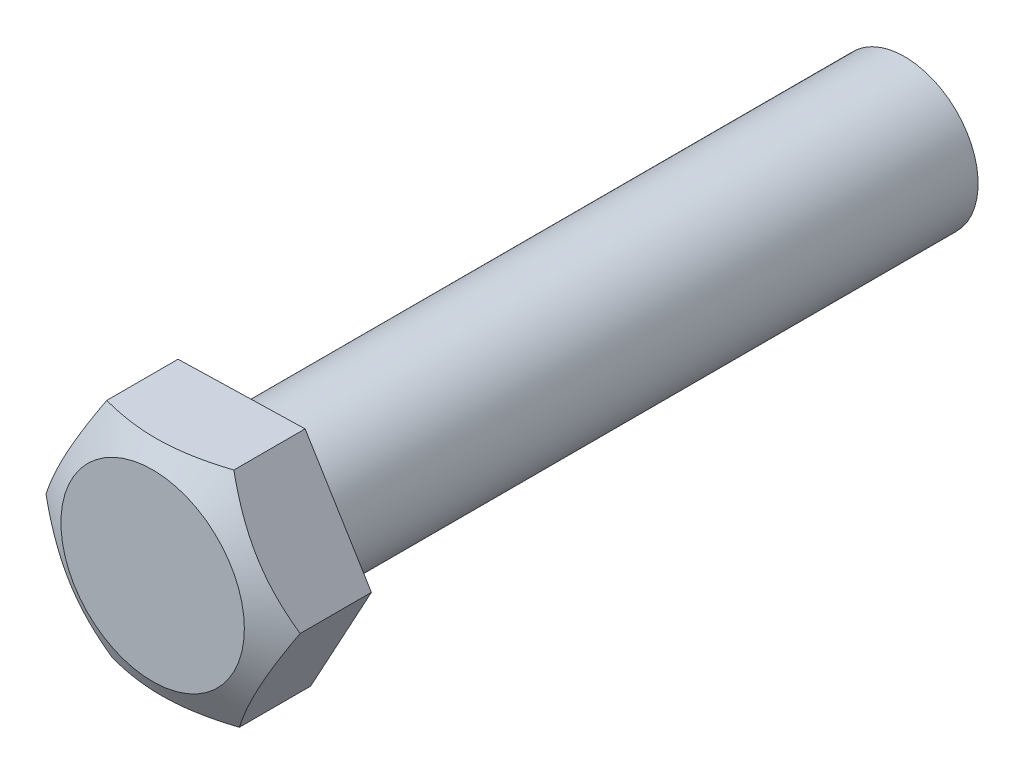
ISO-10303-21;
HEADER;
FILE_DESCRIPTION(('STEP AP214'),'2;1');
FILE_NAME('part.step','',(''),(''),'','','');
FILE_SCHEMA(('AUTOMOTIVE_DESIGN { 1 0 10303 214 1 1 1 1 }'));
ENDSEC;
DATA;
#1=APPLICATION_CONTEXT('core data for automotive mechanical design processes');
#2=APPLICATION_PROTOCOL_DEFINITION('international standard','automotive_design',2000,#1);
#3=PRODUCT_CONTEXT('',#1,'mechanical');
#4=PRODUCT('Part','Part','',(#3));
#5=PRODUCT_RELATED_PRODUCT_CATEGORY('part','',(#4));
#6=PRODUCT_DEFINITION_FORMATION('','',#4);
#7=PRODUCT_DEFINITION_CONTEXT('part definition',#1,'design');
#8=PRODUCT_DEFINITION('design','',#6,#7);
#9=PRODUCT_DEFINITION_SHAPE('','',#8);
#10=(LENGTH_UNIT() NAMED_UNIT(*) SI_UNIT(.MILLI.,.METRE.));
#11=(NAMED_UNIT(*) PLANE_ANGLE_UNIT() SI_UNIT($,.RADIAN.));
#12=(NAMED_UNIT(*) SI_UNIT($,.STERADIAN.) SOLID_ANGLE_UNIT());
#13=UNCERTAINTY_MEASURE_WITH_UNIT(LENGTH_MEASURE(1.E-05),#10,'distance_accuracy_value','');
#14=(GEOMETRIC_REPRESENTATION_CONTEXT(3) GLOBAL_UNCERTAINTY_ASSIGNED_CONTEXT((#13)) GLOBAL_UNIT_ASSIGNED_CONTEXT((#10,
#11,#12)) REPRESENTATION_CONTEXT('',''));
#15=CARTESIAN_POINT('',(0.,0.,0.));
#16=DIRECTION('',(0.,0.,1.));
#17=DIRECTION('',(1.,0.,0.));
#18=AXIS2_PLACEMENT_3D('',#15,#16,#17);
#19=CARTESIAN_POINT('',(17.3150359330285,0.435351166221849,102.5));
#20=DIRECTION('',(-0.853184291000917,-0.521609591159196,0.));
#21=DIRECTION('',(0.521609591159196,-0.853184291000917,0.));
#22=AXIS2_PLACEMENT_3D('',#19,#20,#21);
#23=PLANE('',#22);
#24=CARTESIAN_POINT('',(17.3151582066326,0.43515116622185,99.7168106941296));
#25=CARTESIAN_POINT('',(17.1165824842698,0.759956709995697,99.8267015753732));
#26=CARTESIAN_POINT('',(16.917232209879,1.08602916993449,99.9316058183182));
#27=CARTESIAN_POINT('',(16.5169331062232,1.74078880765869,100.130054912604));
#28=CARTESIAN_POINT('',(16.3159837742192,2.06947680776233,100.223596027869));
#29=CARTESIAN_POINT('',(15.9120981976447,2.73010275317373,100.398061481965));
#30=CARTESIAN_POINT('',(15.7091584187988,3.06204647941113,100.478955969228));
#31=CARTESIAN_POINT('',(15.3018686748109,3.7282405397695,100.626391125923));
#32=CARTESIAN_POINT('',(15.0975187908053,4.06249074117784,100.692932614222));
#33=CARTESIAN_POINT('',(14.6926450598062,4.72473298706844,100.80883153491));
#34=CARTESIAN_POINT('',(14.4921512710168,5.05267586606769,100.858572572056));
#35=CARTESIAN_POINT('',(14.0902449917149,5.71006432242831,100.94197729784));
#36=CARTESIAN_POINT('',(13.8888324835943,6.03950992859065,100.975640677019));
#37=CARTESIAN_POINT('',(13.4856691221248,6.69895456408607,101.026040105919));
#38=CARTESIAN_POINT('',(13.2839189575518,7.02895246680498,101.042796270541));
#39=CARTESIAN_POINT('',(12.8802323933276,7.68925289249076,101.059020916761));
#40=CARTESIAN_POINT('',(12.6782959996238,8.0195554057298,101.058489932531));
#41=CARTESIAN_POINT('',(12.3007772995254,8.63705368402493,101.041347807051));
#42=CARTESIAN_POINT('',(12.1251680897067,8.92429345436618,101.026827592722));
#43=CARTESIAN_POINT('',(11.7743536121434,9.49811227669188,100.984987315502));
#44=CARTESIAN_POINT('',(11.5991483738516,9.78469128050085,100.957666347242));
#45=CARTESIAN_POINT('',(11.249237004764,10.3570329099649,100.890700919685));
#46=CARTESIAN_POINT('',(11.0745314068966,10.6427946639218,100.851046282278));
#47=CARTESIAN_POINT('',(10.7259392629905,11.2129784684146,100.760109247187));
#48=CARTESIAN_POINT('',(10.5520527734532,11.4974004265323,100.708826059025));
#49=CARTESIAN_POINT('',(10.0242106843328,12.3607790648848,100.53623729958));
#50=CARTESIAN_POINT('',(9.6717836267386,12.9372355456692,100.397722851818));
#51=CARTESIAN_POINT('',(8.97218461959457,14.0815528531188,100.083351742079));
#52=CARTESIAN_POINT('',(8.62500371288104,14.6494283308015,99.9075689109206));
#53=CARTESIAN_POINT('',(8.28037052339485,15.213136568554,99.7168106941296));
#54=B_SPLINE_CURVE_WITH_KNOTS('',3,(#24,#25,#26,#27,#28,#29,#30,#31,#32,#33,#34,#35,#36,#37,#38,
#39,#40,#41,#42,#43,#44,#45,#46,#47,#48,#49,#50,#51,#52,#53),.UNSPECIFIED.,.F.,.F.,(4,2,2,2,2,2,
2,2,2,2,2,2,2,2,4),(0.,1.18875423395915,2.3778982658904,3.56980814311689,4.76165000141671,
5.92407438679102,7.08652114536433,8.24758327795976,9.40860953381671,10.4193085296126,
11.4300790206272,12.4416858525291,13.4533614714401,15.5212018248961,17.5849833185538),.UNSPECIFIED.);
#55=CARTESIAN_POINT('',(17.3150359330285,0.43535116622185,99.7168783648703));
#56=VERTEX_POINT('',#55);
#57=CARTESIAN_POINT('',(8.28049279699896,15.212936568554,99.7168783648703));
#58=VERTEX_POINT('',#57);
#59=EDGE_CURVE('E95',#56,#58,#54,.T.);
#60=ORIENTED_EDGE('',*,*,#59,.F.);
#61=DIRECTION('',(0.,0.,-1.));
#62=VECTOR('',#61,1.);
#63=CARTESIAN_POINT('',(17.3150359330285,0.435351166221849,102.5));
#64=LINE('',#63,#62);
#65=CARTESIAN_POINT('',(17.3150359330285,0.435351166221849,90.));
#66=VERTEX_POINT('',#65);
#67=EDGE_CURVE('E64',#56,#66,#64,.T.);
#68=ORIENTED_EDGE('',*,*,#67,.T.);
#69=DIRECTION('',(-0.521609591159196,0.853184291000917,0.));
#70=VECTOR('',#69,1.);
#71=CARTESIAN_POINT('',(17.3150359330285,0.435351166221849,90.));
#72=LINE('',#71,#70);
#73=CARTESIAN_POINT('',(8.28049279699896,15.212936568554,90.));
#74=VERTEX_POINT('',#73);
#75=EDGE_CURVE('E105',#66,#74,#72,.T.);
#76=ORIENTED_EDGE('',*,*,#75,.T.);
#77=DIRECTION('',(0.,0.,-1.));
#78=VECTOR('',#77,1.);
#79=CARTESIAN_POINT('',(8.28049279699896,15.212936568554,102.5));
#80=LINE('',#79,#78);
#81=EDGE_CURVE('E103',#58,#74,#80,.T.);
#82=ORIENTED_EDGE('',*,*,#81,.F.);
#83=EDGE_LOOP('',(#60,#68,#76,#82));
#84=FACE_BOUND('',#83,.T.);
#85=ADVANCED_FACE('F40',(#84),#23,.F.);
#86=CARTESIAN_POINT('',(8.28049279699896,15.212936568554,102.5));
#87=DIRECTION('',(0.02513501130102,-0.999684065696207,0.));
#88=DIRECTION('',(0.999684065696207,0.02513501130102,0.));
#89=AXIS2_PLACEMENT_3D('',#86,#87,#88);
#90=PLANE('',#89);
#91=CARTESIAN_POINT('',(8.28069279699896,15.212941597145,99.7168206110968));
#92=CARTESIAN_POINT('',(7.90011537285567,15.2033727561631,99.8267110821961));
#93=CARTESIAN_POINT('',(7.51805349243785,15.1937665915642,99.9316149048082));
#94=CARTESIAN_POINT('',(6.7508660480607,15.1744772323095,100.13006314023));
#95=CARTESIAN_POINT('',(6.36573952058568,15.1647940134281,100.22360381696));
#96=CARTESIAN_POINT('',(5.5916784935187,15.1453318319943,100.398068375075));
#97=CARTESIAN_POINT('',(5.20273722045012,15.1355526991368,100.478962405175));
#98=CARTESIAN_POINT('',(4.42215201300655,15.1159264805306,100.626396637637));
#99=CARTESIAN_POINT('',(4.03050823413113,15.1060793986916,100.692937658866));
#100=CARTESIAN_POINT('',(3.25455338832283,15.0865696010588,100.808835660384));
#101=CARTESIAN_POINT('',(2.87029992842644,15.0769083336761,100.858576244015));
#102=CARTESIAN_POINT('',(2.10003230071689,15.057541529511,100.941980066949));
#103=CARTESIAN_POINT('',(1.71401809915714,15.0478359918802,100.975642996787));
#104=CARTESIAN_POINT('',(0.941341260339787,15.028408613029,101.026041542926));
#105=CARTESIAN_POINT('',(0.554679943112687,15.0186868049982,101.042797273947));
#106=CARTESIAN_POINT('',(-0.218999598433115,14.9992342152377,101.05902107921));
#107=CARTESIAN_POINT('',(-0.606017811353921,14.9895034337946,101.058489687637));
#108=CARTESIAN_POINT('',(-1.32954345522838,14.9713118612174,101.041346887667));
#109=CARTESIAN_POINT('',(-1.66610245184731,14.9628497735701,101.0268264883));
#110=CARTESIAN_POINT('',(-2.33844627785228,14.9459450631274,100.984986041552));
#111=CARTESIAN_POINT('',(-2.67423105079217,14.9375024417511,100.957665088839));
#112=CARTESIAN_POINT('',(-3.34484404423146,14.9206412495534,100.890699885318));
#113=CARTESIAN_POINT('',(-3.67967124338969,14.9122227044115,100.851045456798));
#114=CARTESIAN_POINT('',(-4.34775592099624,14.8954250815445,100.760109018103));
#115=CARTESIAN_POINT('',(-4.68101329116073,14.8870460065421,100.708826217473));
#116=CARTESIAN_POINT('',(-5.6926344037747,14.8616108626097,100.536238907584));
#117=CARTESIAN_POINT('',(-6.36806868669335,14.8446284489484,100.397725786675));
#118=CARTESIAN_POINT('',(-7.70886582016779,14.8109168471947,100.083357834852));
#119=CARTESIAN_POINT('',(-8.37424583683692,14.7941872274955,99.9075768322541));
#120=CARTESIAN_POINT('',(-9.03474313602957,14.7775803737412,99.7168206110968));
#121=B_SPLINE_CURVE_WITH_KNOTS('',3,(#91,#92,#93,#94,#95,#96,#97,#98,#99,#100,#101,#102,#103,
#104,#105,#106,#107,#108,#109,#110,#111,#112,#113,#114,#115,#116,#117,#118,#119,#120),
.UNSPECIFIED.,.F.,.F.,(4,2,2,2,2,2,2,2,2,2,2,2,2,2,4),(0.,1.18875305866262,2.37789591475583,
3.56980458401566,4.76164523455343,5.9240685561093,7.08651425121304,8.24757533279197,
9.4086005367311,10.4192919280838,11.4300548125104,12.4416540118535,13.453321996548,
15.5211462829323,17.584911823434),.UNSPECIFIED.);
#122=CARTESIAN_POINT('',(-9.03454313602957,14.7775854023322,99.7168783648703));
#123=VERTEX_POINT('',#122);
#124=EDGE_CURVE('E106',#58,#123,#121,.T.);
#125=ORIENTED_EDGE('',*,*,#124,.F.);
#126=ORIENTED_EDGE('',*,*,#81,.T.);
#127=DIRECTION('',(-0.999684065696207,-0.02513501130102,0.));
#128=VECTOR('',#127,1.);
#129=CARTESIAN_POINT('',(8.28049279699896,15.212936568554,90.));
#130=LINE('',#129,#128);
#131=CARTESIAN_POINT('',(-9.03454313602957,14.7775854023322,90.));
#132=VERTEX_POINT('',#131);
#133=EDGE_CURVE('E294',#74,#132,#130,.T.);
#134=ORIENTED_EDGE('',*,*,#133,.T.);
#135=DIRECTION('',(0.,0.,-1.));
#136=VECTOR('',#135,1.);
#137=CARTESIAN_POINT('',(-9.03454313602957,14.7775854023322,102.5));
#138=LINE('',#137,#136);
#139=EDGE_CURVE('E128',#123,#132,#138,.T.);
#140=ORIENTED_EDGE('',*,*,#139,.F.);
#141=EDGE_LOOP('',(#125,#126,#134,#140));
#142=FACE_BOUND('',#141,.T.);
#143=ADVANCED_FACE('F152',(#142),#90,.F.);
#144=CARTESIAN_POINT('',(-9.03454313602957,14.7775854023322,102.5));
#145=DIRECTION('',(0.878319302301937,-0.478074474537011,0.));
#146=DIRECTION('',(0.478074474537011,0.878319302301937,0.));
#147=AXIS2_PLACEMENT_3D('',#144,#145,#146);
#148=PLANE('',#147);
#149=CARTESIAN_POINT('',(-9.03443427482766,14.7777854023322,99.7168126306936));
#150=CARTESIAN_POINT('',(-9.21643623883354,14.4434110599286,99.8267034318453));
#151=CARTESIAN_POINT('',(-9.39914810828523,14.1077324779368,99.9316075927087));
#152=CARTESIAN_POINT('',(-9.76603698127246,13.4336835669244,100.130056519278));
#153=CARTESIAN_POINT('',(-9.95021444558672,13.0953123913604,100.223597548907));
#154=CARTESIAN_POINT('',(-10.3203904512398,12.4152243541795,100.398062828037));
#155=CARTESIAN_POINT('',(-10.5063922318642,12.0735015413414,100.478957226027));
#156=CARTESIAN_POINT('',(-10.8796882797871,11.3876813567744,100.62639220224));
#157=CARTESIAN_POINT('',(-11.0669824727214,11.0435841216677,100.692933599331));
#158=CARTESIAN_POINT('',(-11.4380641569669,10.3618321701142,100.808832340525));
#159=CARTESIAN_POINT('',(-11.621824098881,10.0242280674703,100.85857328911));
#160=CARTESIAN_POINT('',(-11.9901860051316,9.3474728970421,100.941977838588));
#161=CARTESIAN_POINT('',(-12.1747879856066,9.00832179960821,100.97564113002));
#162=CARTESIAN_POINT('',(-12.5443020510253,8.32944988024123,101.026040386537));
#163=CARTESIAN_POINT('',(-12.7292135046836,7.98973021810682,101.042796466486));
#164=CARTESIAN_POINT('',(-13.0992071015302,7.30997730272025,101.059020948486));
#165=CARTESIAN_POINT('',(-13.2842892392675,6.96994405948244,101.058489884711));
#166=CARTESIAN_POINT('',(-13.6302988140094,6.33425463353808,101.041347627517));
#167=CARTESIAN_POINT('',(-13.7912509093944,6.03855314840964,101.026827377055));
#168=CARTESIAN_POINT('',(-14.1127848725705,5.44783036096806,100.984987066729));
#169=CARTESIAN_POINT('',(-14.2733667133669,5.15280910824941,100.957666101505));
#170=CARTESIAN_POINT('',(-14.5940729450037,4.56360703071138,100.890700717696));
#171=CARTESIAN_POINT('',(-14.7541968473988,4.26942710326446,100.85104612108));
#172=CARTESIAN_POINT('',(-15.0736939629991,3.68244641592848,100.760109202452));
#173=CARTESIAN_POINT('',(-15.2330671244189,3.38964575117964,100.708826089966));
#174=CARTESIAN_POINT('',(-15.7168531885299,2.5008331060267,100.536237613587));
#175=CARTESIAN_POINT('',(-16.0398651304317,1.90739497335669,100.39772342493));
#176=CARTESIAN_POINT('',(-16.6810725299099,0.729367561861971,100.083352931862));
#177=CARTESIAN_POINT('',(-16.9992761969998,0.144763200503869,99.9075704577816));
#178=CARTESIAN_POINT('',(-17.3151447942304,-0.435551166221849,99.7168126306936));
#179=B_SPLINE_CURVE_WITH_KNOTS('',3,(#149,#150,#151,#152,#153,#154,#155,#156,#157,#158,#159,
#160,#161,#162,#163,#164,#165,#166,#167,#168,#169,#170,#171,#172,#173,#174,#175,#176,#177,#178),
.UNSPECIFIED.,.F.,.F.,(4,2,2,2,2,2,2,2,2,2,2,2,2,2,4),(0.,1.18875400444979,2.37789780676592,
3.56980744810329,4.76164907055395,5.92407324818807,7.08651979908933,8.24758172644452,
9.40860777688521,10.4193052877038,11.4300742933223,12.4416796347565,13.4533537628761,
15.5211909787924,17.5849693571557),.UNSPECIFIED.);
#180=CARTESIAN_POINT('',(-17.3150359330285,-0.43535116622185,99.7168783648703));
#181=VERTEX_POINT('',#180);
#182=EDGE_CURVE('E203',#123,#181,#179,.T.);
#183=ORIENTED_EDGE('',*,*,#182,.F.);
#184=ORIENTED_EDGE('',*,*,#139,.T.);
#185=DIRECTION('',(-0.478074474537011,-0.878319302301937,0.));
#186=VECTOR('',#185,1.);
#187=CARTESIAN_POINT('',(-9.03454313602957,14.7775854023322,90.));
#188=LINE('',#187,#186);
#189=CARTESIAN_POINT('',(-17.3150359330285,-0.43535116622185,90.));
#190=VERTEX_POINT('',#189);
#191=EDGE_CURVE('E296',#132,#190,#188,.T.);
#192=ORIENTED_EDGE('',*,*,#191,.T.);
#193=DIRECTION('',(0.,0.,-1.));
#194=VECTOR('',#193,1.);
#195=CARTESIAN_POINT('',(-17.3150359330285,-0.43535116622185,102.5));
#196=LINE('',#195,#194);
#197=EDGE_CURVE('E125',#181,#190,#196,.T.);
#198=ORIENTED_EDGE('',*,*,#197,.F.);
#199=EDGE_LOOP('',(#183,#184,#192,#198));
#200=FACE_BOUND('',#199,.T.);
#201=ADVANCED_FACE('F156',(#200),#148,.F.);
#202=CARTESIAN_POINT('',(-17.3150359330285,-0.43535116622185,102.5));
#203=DIRECTION('',(0.853184291000916,0.521609591159196,0.));
#204=DIRECTION('',(-0.521609591159196,0.853184291000916,0.));
#205=AXIS2_PLACEMENT_3D('',#202,#203,#204);
#206=PLANE('',#205);
#207=CARTESIAN_POINT('',(-17.3151582066326,-0.435151166221852,99.7168106941296));
#208=CARTESIAN_POINT('',(-17.1165824842698,-0.759956709995697,99.8267015753732));
#209=CARTESIAN_POINT('',(-16.917232209879,-1.08602916993449,99.9316058183182));
#210=CARTESIAN_POINT('',(-16.5169331062232,-1.74078880765869,100.130054912604));
#211=CARTESIAN_POINT('',(-16.3159837742192,-2.06947680776233,100.223596027869));
#212=CARTESIAN_POINT('',(-15.9120981976447,-2.73010275317373,100.398061481965));
#213=CARTESIAN_POINT('',(-15.7091584187988,-3.06204647941113,100.478955969228));
#214=CARTESIAN_POINT('',(-15.3018686748109,-3.7282405397695,100.626391125923));
#215=CARTESIAN_POINT('',(-15.0975187908053,-4.06249074117784,100.692932614222));
#216=CARTESIAN_POINT('',(-14.6926450598062,-4.72473298706843,100.80883153491));
#217=CARTESIAN_POINT('',(-14.4921512710168,-5.05267586606769,100.858572572056));
#218=CARTESIAN_POINT('',(-14.0902449917149,-5.71006432242831,100.94197729784));
#219=CARTESIAN_POINT('',(-13.8888324835943,-6.03950992859064,100.975640677019));
#220=CARTESIAN_POINT('',(-13.4856691221248,-6.69895456408607,101.026040105919));
#221=CARTESIAN_POINT('',(-13.2839189575518,-7.02895246680498,101.042796270541));
#222=CARTESIAN_POINT('',(-12.8802323933276,-7.68925289249076,101.059020916761));
#223=CARTESIAN_POINT('',(-12.6782959996238,-8.0195554057298,101.058489932531));
#224=CARTESIAN_POINT('',(-12.3007772995254,-8.63705368402493,101.041347807051));
#225=CARTESIAN_POINT('',(-12.1251680897067,-8.92429345436618,101.026827592722));
#226=CARTESIAN_POINT('',(-11.7743536121434,-9.49811227669188,100.984987315502));
#227=CARTESIAN_POINT('',(-11.5991483738516,-9.78469128050085,100.957666347242));
#228=CARTESIAN_POINT('',(-11.249237004764,-10.3570329099649,100.890700919685));
#229=CARTESIAN_POINT('',(-11.0745314068966,-10.6427946639218,100.851046282278));
#230=CARTESIAN_POINT('',(-10.7259392629905,-11.2129784684146,100.760109247187));
#231=CARTESIAN_POINT('',(-10.5520527734532,-11.4974004265323,100.708826059025));
#232=CARTESIAN_POINT('',(-10.0242106843328,-12.3607790648848,100.53623729958));
#233=CARTESIAN_POINT('',(-9.6717836267386,-12.9372355456692,100.397722851818));
#234=CARTESIAN_POINT('',(-8.97218461959456,-14.0815528531188,100.083351742079));
#235=CARTESIAN_POINT('',(-8.62500371288103,-14.6494283308015,99.9075689109206));
#236=CARTESIAN_POINT('',(-8.28037052339485,-15.213136568554,99.7168106941296));
#237=B_SPLINE_CURVE_WITH_KNOTS('',3,(#207,#208,#209,#210,#211,#212,#213,#214,#215,#216,#217,
#218,#219,#220,#221,#222,#223,#224,#225,#226,#227,#228,#229,#230,#231,#232,#233,#234,#235,#236),
.UNSPECIFIED.,.F.,.F.,(4,2,2,2,2,2,2,2,2,2,2,2,2,2,4),(0.,1.18875423395915,2.3778982658904,
3.56980814311688,4.7616500014167,5.92407438679101,7.08652114536432,8.24758327795976,
9.4086095338167,10.4193085296126,11.4300790206272,12.4416858525291,13.4533614714401,
15.5212018248961,17.5849833185538),.UNSPECIFIED.);
#238=CARTESIAN_POINT('',(-8.28049279699896,-15.212936568554,99.7168783648703));
#239=VERTEX_POINT('',#238);
#240=EDGE_CURVE('E197',#181,#239,#237,.T.);
#241=ORIENTED_EDGE('',*,*,#240,.F.);
#242=ORIENTED_EDGE('',*,*,#197,.T.);
#243=DIRECTION('',(0.521609591159196,-0.853184291000916,0.));
#244=VECTOR('',#243,1.);
#245=CARTESIAN_POINT('',(-17.3150359330285,-0.43535116622185,90.));
#246=LINE('',#245,#244);
#247=CARTESIAN_POINT('',(-8.28049279699896,-15.212936568554,90.));
#248=VERTEX_POINT('',#247);
#249=EDGE_CURVE('E299',#190,#248,#246,.T.);
#250=ORIENTED_EDGE('',*,*,#249,.T.);
#251=DIRECTION('',(0.,0.,-1.));
#252=VECTOR('',#251,1.);
#253=CARTESIAN_POINT('',(-8.28049279699896,-15.212936568554,102.5));
#254=LINE('',#253,#252);
#255=EDGE_CURVE('E117',#239,#248,#254,.T.);
#256=ORIENTED_EDGE('',*,*,#255,.F.);
#257=EDGE_LOOP('',(#241,#242,#250,#256));
#258=FACE_BOUND('',#257,.T.);
#259=ADVANCED_FACE('F211',(#258),#206,.F.);
#260=CARTESIAN_POINT('',(-8.28049279699896,-15.212936568554,102.5));
#261=DIRECTION('',(-0.0251350113010201,0.999684065696207,0.));
#262=DIRECTION('',(-0.999684065696207,-0.0251350113010201,0.));
#263=AXIS2_PLACEMENT_3D('',#260,#261,#262);
#264=PLANE('',#263);
#265=CARTESIAN_POINT('',(-8.28069279699896,-15.212941597145,99.7168206110968));
#266=CARTESIAN_POINT('',(-7.90011537285567,-15.2033727561631,99.8267110821961));
#267=CARTESIAN_POINT('',(-7.51805349243784,-15.1937665915642,99.9316149048082));
#268=CARTESIAN_POINT('',(-6.75086604806069,-15.1744772323095,100.13006314023));
#269=CARTESIAN_POINT('',(-6.36573952058568,-15.1647940134281,100.22360381696));
#270=CARTESIAN_POINT('',(-5.5916784935187,-15.1453318319943,100.398068375075));
#271=CARTESIAN_POINT('',(-5.20273722045012,-15.1355526991368,100.478962405175));
#272=CARTESIAN_POINT('',(-4.42215201300654,-15.1159264805306,100.626396637637));
#273=CARTESIAN_POINT('',(-4.03050823413113,-15.1060793986916,100.692937658866));
#274=CARTESIAN_POINT('',(-3.25455338832283,-15.0865696010588,100.808835660384));
#275=CARTESIAN_POINT('',(-2.87029992842644,-15.0769083336761,100.858576244015));
#276=CARTESIAN_POINT('',(-2.10003230071688,-15.057541529511,100.941980066949));
#277=CARTESIAN_POINT('',(-1.71401809915714,-15.0478359918802,100.975642996787));
#278=CARTESIAN_POINT('',(-0.941341260339784,-15.028408613029,101.026041542926));
#279=CARTESIAN_POINT('',(-0.554679943112684,-15.0186868049982,101.042797273947));
#280=CARTESIAN_POINT('',(0.218999598433119,-14.9992342152377,101.05902107921));
#281=CARTESIAN_POINT('',(0.606017811353924,-14.9895034337946,101.058489687637));
#282=CARTESIAN_POINT('',(1.32954345522839,-14.9713118612174,101.041346887667));
#283=CARTESIAN_POINT('',(1.66610245184731,-14.9628497735701,101.0268264883));
#284=CARTESIAN_POINT('',(2.33844627785228,-14.9459450631274,100.984986041552));
#285=CARTESIAN_POINT('',(2.67423105079217,-14.9375024417511,100.957665088839));
#286=CARTESIAN_POINT('',(3.34484404423146,-14.9206412495534,100.890699885318));
#287=CARTESIAN_POINT('',(3.67967124338969,-14.9122227044115,100.851045456798));
#288=CARTESIAN_POINT('',(4.34775592099624,-14.8954250815445,100.760109018103));
#289=CARTESIAN_POINT('',(4.68101329116073,-14.8870460065421,100.708826217473));
#290=CARTESIAN_POINT('',(5.6926344037747,-14.8616108626097,100.536238907584));
#291=CARTESIAN_POINT('',(6.36806868669335,-14.8446284489484,100.397725786675));
#292=CARTESIAN_POINT('',(7.70886582016779,-14.8109168471947,100.083357834852));
#293=CARTESIAN_POINT('',(8.37424583683692,-14.7941872274955,99.9075768322541));
#294=CARTESIAN_POINT('',(9.03474313602957,-14.7775803737412,99.7168206110968));
#295=B_SPLINE_CURVE_WITH_KNOTS('',3,(#265,#266,#267,#268,#269,#270,#271,#272,#273,#274,#275,
#276,#277,#278,#279,#280,#281,#282,#283,#284,#285,#286,#287,#288,#289,#290,#291,#292,#293,#294),
.UNSPECIFIED.,.F.,.F.,(4,2,2,2,2,2,2,2,2,2,2,2,2,2,4),(0.,1.18875305866262,2.37789591475583,
3.56980458401566,4.76164523455343,5.9240685561093,7.08651425121304,8.24757533279197,
9.4086005367311,10.4192919280838,11.4300548125104,12.4416540118535,13.453321996548,
15.5211462829323,17.584911823434),.UNSPECIFIED.);
#296=CARTESIAN_POINT('',(9.03454313602957,-14.7775854023322,99.7168783648703));
#297=VERTEX_POINT('',#296);
#298=EDGE_CURVE('E56',#239,#297,#295,.T.);
#299=ORIENTED_EDGE('',*,*,#298,.F.);
#300=ORIENTED_EDGE('',*,*,#255,.T.);
#301=DIRECTION('',(0.999684065696207,0.0251350113010201,0.));
#302=VECTOR('',#301,1.);
#303=CARTESIAN_POINT('',(-8.28049279699896,-15.212936568554,90.));
#304=LINE('',#303,#302);
#305=CARTESIAN_POINT('',(9.03454313602957,-14.7775854023322,90.));
#306=VERTEX_POINT('',#305);
#307=EDGE_CURVE('E119',#248,#306,#304,.T.);
#308=ORIENTED_EDGE('',*,*,#307,.T.);
#309=DIRECTION('',(0.,0.,-1.));
#310=VECTOR('',#309,1.);
#311=CARTESIAN_POINT('',(9.03454313602957,-14.7775854023322,102.5));
#312=LINE('',#311,#310);
#313=EDGE_CURVE('E113',#297,#306,#312,.T.);
#314=ORIENTED_EDGE('',*,*,#313,.F.);
#315=EDGE_LOOP('',(#299,#300,#308,#314));
#316=FACE_BOUND('',#315,.T.);
#317=ADVANCED_FACE('F215',(#316),#264,.F.);
#318=CARTESIAN_POINT('',(9.03454313602957,-14.7775854023322,102.5));
#319=DIRECTION('',(-0.878319302301937,0.478074474537011,0.));
#320=DIRECTION('',(-0.478074474537011,-0.878319302301937,0.));
#321=AXIS2_PLACEMENT_3D('',#318,#319,#320);
#322=PLANE('',#321);
#323=CARTESIAN_POINT('',(9.03443427482766,-14.7777854023322,99.7168126306936));
#324=CARTESIAN_POINT('',(9.21643623883355,-14.4434110599286,99.8267034318453));
#325=CARTESIAN_POINT('',(9.39914810828523,-14.1077324779368,99.9316075927087));
#326=CARTESIAN_POINT('',(9.76603698127246,-13.4336835669244,100.130056519278));
#327=CARTESIAN_POINT('',(9.95021444558673,-13.0953123913604,100.223597548907));
#328=CARTESIAN_POINT('',(10.3203904512398,-12.4152243541795,100.398062828037));
#329=CARTESIAN_POINT('',(10.5063922318642,-12.0735015413414,100.478957226027));
#330=CARTESIAN_POINT('',(10.8796882797871,-11.3876813567744,100.62639220224));
#331=CARTESIAN_POINT('',(11.0669824727214,-11.0435841216676,100.692933599331));
#332=CARTESIAN_POINT('',(11.4380641569669,-10.3618321701142,100.808832340525));
#333=CARTESIAN_POINT('',(11.621824098881,-10.0242280674703,100.85857328911));
#334=CARTESIAN_POINT('',(11.9901860051316,-9.3474728970421,100.941977838588));
#335=CARTESIAN_POINT('',(12.1747879856066,-9.00832179960821,100.97564113002));
#336=CARTESIAN_POINT('',(12.5443020510253,-8.32944988024122,101.026040386537));
#337=CARTESIAN_POINT('',(12.7292135046836,-7.98973021810682,101.042796466486));
#338=CARTESIAN_POINT('',(13.0992071015302,-7.30997730272024,101.059020948486));
#339=CARTESIAN_POINT('',(13.2842892392675,-6.96994405948243,101.058489884711));
#340=CARTESIAN_POINT('',(13.6302988140094,-6.33425463353807,101.041347627517));
#341=CARTESIAN_POINT('',(13.7912509093944,-6.03855314840964,101.026827377055));
#342=CARTESIAN_POINT('',(14.1127848725705,-5.44783036096806,100.984987066729));
#343=CARTESIAN_POINT('',(14.2733667133669,-5.1528091082494,100.957666101505));
#344=CARTESIAN_POINT('',(14.5940729450037,-4.56360703071138,100.890700717696));
#345=CARTESIAN_POINT('',(14.7541968473988,-4.26942710326445,100.85104612108));
#346=CARTESIAN_POINT('',(15.0736939629991,-3.68244641592848,100.760109202452));
#347=CARTESIAN_POINT('',(15.2330671244189,-3.38964575117963,100.708826089966));
#348=CARTESIAN_POINT('',(15.7168531885299,-2.50083310602669,100.536237613587));
#349=CARTESIAN_POINT('',(16.0398651304317,-1.90739497335669,100.39772342493));
#350=CARTESIAN_POINT('',(16.6810725299099,-0.729367561861972,100.083352931862));
#351=CARTESIAN_POINT('',(16.9992761969998,-0.14476320050387,99.9075704577816));
#352=CARTESIAN_POINT('',(17.3151447942304,0.43555116622185,99.7168126306936));
#353=B_SPLINE_CURVE_WITH_KNOTS('',3,(#323,#324,#325,#326,#327,#328,#329,#330,#331,#332,#333,
#334,#335,#336,#337,#338,#339,#340,#341,#342,#343,#344,#345,#346,#347,#348,#349,#350,#351,#352),
.UNSPECIFIED.,.F.,.F.,(4,2,2,2,2,2,2,2,2,2,2,2,2,2,4),(0.,1.18875400444978,2.37789780676592,
3.56980744810329,4.76164907055395,5.92407324818808,7.08651979908933,8.24758172644452,
9.40860777688521,10.4193052877038,11.4300742933223,12.4416796347565,13.4533537628761,
15.5211909787924,17.5849693571557),.UNSPECIFIED.);
#354=EDGE_CURVE('E93',#297,#56,#353,.T.);
#355=ORIENTED_EDGE('',*,*,#354,.F.);
#356=ORIENTED_EDGE('',*,*,#313,.T.);
#357=DIRECTION('',(0.478074474537011,0.878319302301937,0.));
#358=VECTOR('',#357,1.);
#359=CARTESIAN_POINT('',(9.03454313602957,-14.7775854023322,90.));
#360=LINE('',#359,#358);
#361=EDGE_CURVE('E110',#306,#66,#360,.T.);
#362=ORIENTED_EDGE('',*,*,#361,.T.);
#363=ORIENTED_EDGE('',*,*,#67,.F.);
#364=EDGE_LOOP('',(#355,#356,#362,#363));
#365=FACE_BOUND('',#364,.T.);
#366=ADVANCED_FACE('F108',(#365),#322,.F.);
#367=CARTESIAN_POINT('',(0.,0.,90.));
#368=DIRECTION('',(0.,0.,-1.));
#369=DIRECTION('',(-1.,0.,0.));
#370=AXIS2_PLACEMENT_3D('',#367,#368,#369);
#371=CYLINDRICAL_SURFACE('',#370,10.);
#372=CARTESIAN_POINT('',(0.,0.,90.));
#373=DIRECTION('',(0.,0.,1.));
#374=DIRECTION('',(1.,0.,0.));
#375=AXIS2_PLACEMENT_3D('',#372,#373,#374);
#376=CIRCLE('',#375,10.);
#377=CARTESIAN_POINT('',(-10.,0.,90.));
#378=VERTEX_POINT('',#377);
#379=EDGE_CURVE('E12',#378,#378,#376,.T.);
#380=CARTESIAN_POINT('',(0.,0.,0.));
#381=DIRECTION('',(0.,0.,1.));
#382=DIRECTION('',(1.,0.,0.));
#383=AXIS2_PLACEMENT_3D('',#380,#381,#382);
#384=CIRCLE('',#383,10.);
#385=CARTESIAN_POINT('',(-10.,0.,0.));
#386=VERTEX_POINT('',#385);
#387=EDGE_CURVE('E44',#386,#386,#384,.T.);
#388=CARTESIAN_POINT('',(-10.,0.,90.));
#389=CARTESIAN_POINT('',(-10.,0.,89.0625));
#390=CARTESIAN_POINT('',(-10.,0.,88.125));
#391=CARTESIAN_POINT('',(-10.,0.,86.25));
#392=CARTESIAN_POINT('',(-10.,0.,85.3125));
#393=CARTESIAN_POINT('',(-10.,0.,83.4375));
#394=CARTESIAN_POINT('',(-10.,0.,82.5));
#395=CARTESIAN_POINT('',(-10.,0.,80.625));
#396=CARTESIAN_POINT('',(-10.,0.,79.6875));
#397=CARTESIAN_POINT('',(-10.,0.,77.8125));
#398=CARTESIAN_POINT('',(-10.,0.,76.875));
#399=CARTESIAN_POINT('',(-10.,0.,75.));
#400=CARTESIAN_POINT('',(-10.,0.,74.0625));
#401=CARTESIAN_POINT('',(-10.,0.,72.1875));
#402=CARTESIAN_POINT('',(-10.,0.,71.25));
#403=CARTESIAN_POINT('',(-10.,0.,69.375));
#404=CARTESIAN_POINT('',(-10.,0.,68.4375));
#405=CARTESIAN_POINT('',(-10.,0.,66.5625));
#406=CARTESIAN_POINT('',(-10.,0.,65.625));
#407=CARTESIAN_POINT('',(-10.,0.,63.75));
#408=CARTESIAN_POINT('',(-10.,0.,62.8125));
#409=CARTESIAN_POINT('',(-10.,0.,60.9375));
#410=CARTESIAN_POINT('',(-10.,0.,60.));
#411=CARTESIAN_POINT('',(-10.,0.,58.125));
#412=CARTESIAN_POINT('',(-10.,0.,57.1875));
#413=CARTESIAN_POINT('',(-10.,0.,55.3125));
#414=CARTESIAN_POINT('',(-10.,0.,54.375));
#415=CARTESIAN_POINT('',(-10.,0.,52.5));
#416=CARTESIAN_POINT('',(-10.,0.,51.5625));
#417=CARTESIAN_POINT('',(-10.,0.,49.6875));
#418=CARTESIAN_POINT('',(-10.,0.,48.75));
#419=CARTESIAN_POINT('',(-10.,0.,46.875));
#420=CARTESIAN_POINT('',(-10.,0.,45.9375));
#421=CARTESIAN_POINT('',(-10.,0.,44.0625));
#422=CARTESIAN_POINT('',(-10.,0.,43.125));
#423=CARTESIAN_POINT('',(-10.,0.,41.25));
#424=CARTESIAN_POINT('',(-10.,0.,40.3125));
#425=CARTESIAN_POINT('',(-10.,0.,38.4375));
#426=CARTESIAN_POINT('',(-10.,0.,37.5));
#427=CARTESIAN_POINT('',(-10.,0.,35.625));
#428=CARTESIAN_POINT('',(-10.,0.,34.6875));
#429=CARTESIAN_POINT('',(-10.,0.,32.8125));
#430=CARTESIAN_POINT('',(-10.,0.,31.875));
#431=CARTESIAN_POINT('',(-10.,0.,30.));
#432=CARTESIAN_POINT('',(-10.,0.,29.0625));
#433=CARTESIAN_POINT('',(-10.,0.,27.1875));
#434=CARTESIAN_POINT('',(-10.,0.,26.25));
#435=CARTESIAN_POINT('',(-10.,0.,24.375));
#436=CARTESIAN_POINT('',(-10.,0.,23.4375));
#437=CARTESIAN_POINT('',(-10.,0.,21.5625));
#438=CARTESIAN_POINT('',(-10.,0.,20.625));
#439=CARTESIAN_POINT('',(-10.,0.,18.75));
#440=CARTESIAN_POINT('',(-10.,0.,17.8125));
#441=CARTESIAN_POINT('',(-10.,0.,15.9375));
#442=CARTESIAN_POINT('',(-10.,0.,15.));
#443=CARTESIAN_POINT('',(-10.,0.,13.125));
#444=CARTESIAN_POINT('',(-10.,0.,12.1875));
#445=CARTESIAN_POINT('',(-10.,0.,10.3125));
#446=CARTESIAN_POINT('',(-10.,0.,9.37499999999999));
#447=CARTESIAN_POINT('',(-10.,0.,7.49999999999999));
#448=CARTESIAN_POINT('',(-10.,0.,6.56249999999999));
#449=CARTESIAN_POINT('',(-10.,0.,4.68749999999999));
#450=CARTESIAN_POINT('',(-10.,0.,3.74999999999998));
#451=CARTESIAN_POINT('',(-10.,0.,1.87499999999998));
#452=CARTESIAN_POINT('',(-10.,0.,0.937499999999986));
#453=CARTESIAN_POINT('',(-10.,0.,0.));
#454=B_SPLINE_CURVE_WITH_KNOTS('',3,(#388,#389,#390,#391,#392,#393,#394,#395,#396,#397,#398,
#399,#400,#401,#402,#403,#404,#405,#406,#407,#408,#409,#410,#411,#412,#413,#414,#415,#416,#417,
#418,#419,#420,#421,#422,#423,#424,#425,#426,#427,#428,#429,#430,#431,#432,#433,#434,#435,#436,
#437,#438,#439,#440,#441,#442,#443,#444,#445,#446,#447,#448,#449,#450,#451,#452,#453),
.UNSPECIFIED.,.F.,.F.,(4,2,2,2,2,2,2,2,2,2,2,2,2,2,2,2,2,2,2,2,2,2,2,2,2,2,2,2,2,2,2,2,4),(0.,
2.81250000000001,5.62500000000001,8.43750000000001,11.25,14.0625,16.875,19.6875,22.5,25.3125,
28.125,30.9375,33.75,36.5625,39.375,42.1875,45.,47.8125,50.625,53.4375,56.25,59.0625,61.875,
64.6875,67.5,70.3125,73.125,75.9375,78.75,81.5625,84.375,87.1875,90.),.UNSPECIFIED.);
#455=EDGE_CURVE('BSEAM42',#378,#386,#454,.T.);
#456=ORIENTED_EDGE('',*,*,#379,.F.);
#457=ORIENTED_EDGE('',*,*,#387,.T.);
#458=ORIENTED_EDGE('',*,*,#455,.T.);
#459=ORIENTED_EDGE('',*,*,#455,.F.);
#460=EDGE_LOOP('',(#456,#458,#457,#459));
#461=FACE_BOUND('',#460,.T.);
#462=ADVANCED_FACE('F42',(#461),#371,.T.);
#463=CARTESIAN_POINT('',(0.,0.,0.));
#464=DIRECTION('',(0.,0.,1.));
#465=DIRECTION('',(1.,0.,0.));
#466=AXIS2_PLACEMENT_3D('',#463,#464,#465);
#467=PLANE('',#466);
#468=ORIENTED_EDGE('',*,*,#387,.F.);
#469=EDGE_LOOP('',(#468));
#470=FACE_BOUND('',#469,.T.);
#471=ADVANCED_FACE('F140',(#470),#467,.F.);
#472=CARTESIAN_POINT('',(0.,0.,90.));
#473=DIRECTION('',(0.,0.,1.));
#474=DIRECTION('',(1.,0.,0.));
#475=AXIS2_PLACEMENT_3D('',#472,#473,#474);
#476=PLANE('',#475);
#477=ORIENTED_EDGE('',*,*,#379,.T.);
#478=EDGE_LOOP('',(#477));
#479=FACE_BOUND('',#478,.T.);
#480=ORIENTED_EDGE('',*,*,#75,.F.);
#481=ORIENTED_EDGE('',*,*,#361,.F.);
#482=ORIENTED_EDGE('',*,*,#307,.F.);
#483=ORIENTED_EDGE('',*,*,#249,.F.);
#484=ORIENTED_EDGE('',*,*,#191,.F.);
#485=ORIENTED_EDGE('',*,*,#133,.F.);
#486=EDGE_LOOP('',(#480,#481,#482,#483,#484,#485));
#487=FACE_BOUND('',#486,.T.);
#488=ADVANCED_FACE('F142',(#479,#487),#476,.F.);
#489=CARTESIAN_POINT('',(0.,0.,102.5));
#490=DIRECTION('',(0.,0.,-1.));
#491=DIRECTION('',(1.,0.,0.));
#492=AXIS2_PLACEMENT_3D('',#489,#490,#491);
#493=CONICAL_SURFACE('',#492,12.4999999999999,1.0471975511966);
#494=CARTESIAN_POINT('',(0.,0.,102.5));
#495=DIRECTION('',(0.,0.,1.));
#496=DIRECTION('',(1.,0.,0.));
#497=AXIS2_PLACEMENT_3D('',#494,#495,#496);
#498=CIRCLE('',#497,12.4999999999999);
#499=CARTESIAN_POINT('',(12.4999999999999,0.,102.5));
#500=VERTEX_POINT('',#499);
#501=EDGE_CURVE('E100',#500,#500,#498,.T.);
#502=ORIENTED_EDGE('',*,*,#501,.F.);
#503=EDGE_LOOP('',(#502));
#504=FACE_BOUND('',#503,.T.);
#505=ORIENTED_EDGE('',*,*,#59,.T.);
#506=ORIENTED_EDGE('',*,*,#124,.T.);
#507=ORIENTED_EDGE('',*,*,#182,.T.);
#508=ORIENTED_EDGE('',*,*,#240,.T.);
#509=ORIENTED_EDGE('',*,*,#298,.T.);
#510=ORIENTED_EDGE('',*,*,#354,.T.);
#511=EDGE_LOOP('',(#505,#506,#507,#508,#509,#510));
#512=FACE_BOUND('',#511,.T.);
#513=ADVANCED_FACE('F94',(#504,#512),#493,.T.);
#514=CARTESIAN_POINT('',(0.,0.,102.5));
#515=DIRECTION('',(0.,0.,1.));
#516=DIRECTION('',(1.,0.,0.));
#517=AXIS2_PLACEMENT_3D('',#514,#515,#516);
#518=PLANE('',#517);
#519=ORIENTED_EDGE('',*,*,#501,.T.);
#520=EDGE_LOOP('',(#519));
#521=FACE_BOUND('',#520,.T.);
#522=ADVANCED_FACE('F177',(#521),#518,.T.);
#523=CLOSED_SHELL('',(#85,#143,#201,#259,#317,#366,#462,#471,#488,#513,#522));
#524=MANIFOLD_SOLID_BREP('B2',#523);
#525=ADVANCED_BREP_SHAPE_REPRESENTATION('',(#18,#524),#14);
#526=SHAPE_DEFINITION_REPRESENTATION(#9,#525);
ENDSEC;
END-ISO-10303-21;
